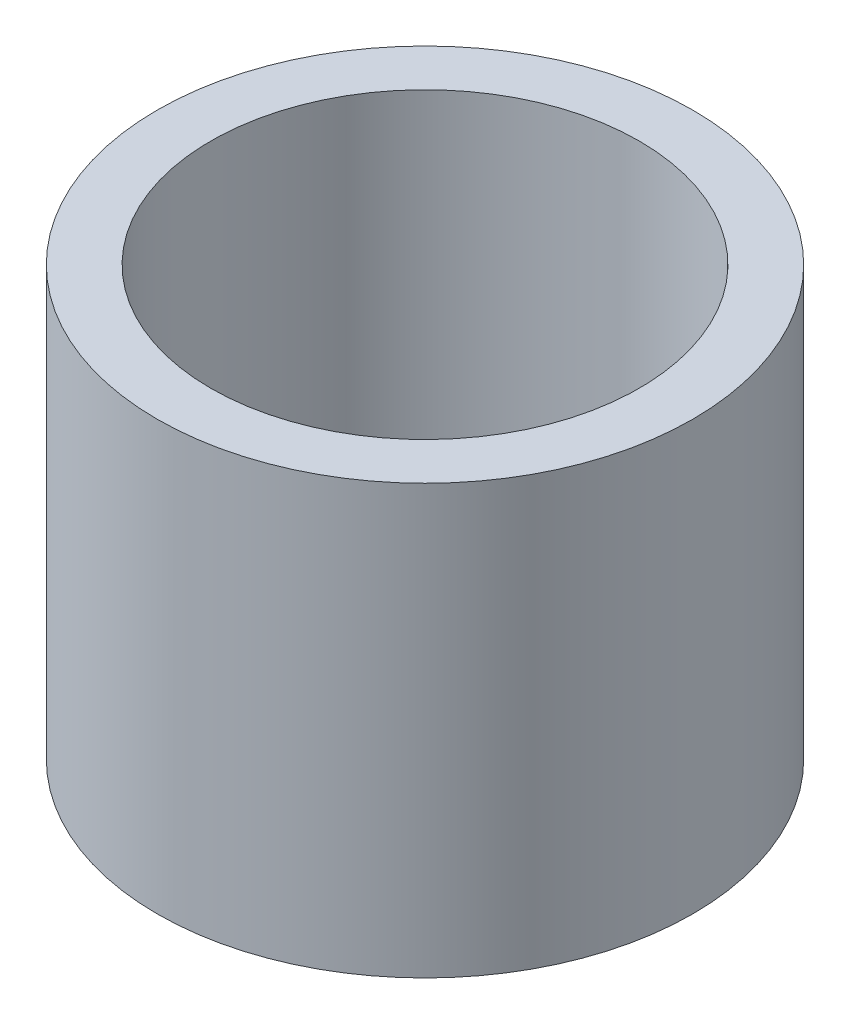
ISO-10303-21;
HEADER;
FILE_DESCRIPTION(('STEP AP214'),'2;1');
FILE_NAME('part.step','',(''),(''),'','','');
FILE_SCHEMA(('AUTOMOTIVE_DESIGN { 1 0 10303 214 1 1 1 1 }'));
ENDSEC;
DATA;
#1=APPLICATION_CONTEXT('core data for automotive mechanical design processes');
#2=APPLICATION_PROTOCOL_DEFINITION('international standard','automotive_design',2000,#1);
#3=PRODUCT_CONTEXT('',#1,'mechanical');
#4=PRODUCT('Part','Part','',(#3));
#5=PRODUCT_RELATED_PRODUCT_CATEGORY('part','',(#4));
#6=PRODUCT_DEFINITION_FORMATION('','',#4);
#7=PRODUCT_DEFINITION_CONTEXT('part definition',#1,'design');
#8=PRODUCT_DEFINITION('design','',#6,#7);
#9=PRODUCT_DEFINITION_SHAPE('','',#8);
#10=(LENGTH_UNIT() NAMED_UNIT(*) SI_UNIT(.MILLI.,.METRE.));
#11=(NAMED_UNIT(*) PLANE_ANGLE_UNIT() SI_UNIT($,.RADIAN.));
#12=(NAMED_UNIT(*) SI_UNIT($,.STERADIAN.) SOLID_ANGLE_UNIT());
#13=UNCERTAINTY_MEASURE_WITH_UNIT(LENGTH_MEASURE(1.E-05),#10,'distance_accuracy_value','');
#14=(GEOMETRIC_REPRESENTATION_CONTEXT(3) GLOBAL_UNCERTAINTY_ASSIGNED_CONTEXT((#13)) GLOBAL_UNIT_ASSIGNED_CONTEXT((#10,
#11,#12)) REPRESENTATION_CONTEXT('',''));
#15=CARTESIAN_POINT('',(0.,0.,0.));
#16=DIRECTION('',(0.,0.,1.));
#17=DIRECTION('',(1.,0.,0.));
#18=AXIS2_PLACEMENT_3D('',#15,#16,#17);
#19=CARTESIAN_POINT('',(0.,50.8,0.));
#20=DIRECTION('',(0.,1.,0.));
#21=DIRECTION('',(0.,0.,1.));
#22=AXIS2_PLACEMENT_3D('',#19,#20,#21);
#23=PLANE('',#22);
#24=CARTESIAN_POINT('',(0.,50.8,0.));
#25=DIRECTION('',(0.,1.,0.));
#26=DIRECTION('',(0.,0.,1.));
#27=AXIS2_PLACEMENT_3D('',#24,#25,#26);
#28=CIRCLE('',#27,31.75);
#29=CARTESIAN_POINT('',(0.,50.8,31.75));
#30=VERTEX_POINT('',#29);
#31=EDGE_CURVE('E10',#30,#30,#28,.T.);
#32=ORIENTED_EDGE('',*,*,#31,.T.);
#33=EDGE_LOOP('',(#32));
#34=FACE_BOUND('',#33,.T.);
#35=CARTESIAN_POINT('',(0.,50.8,0.));
#36=DIRECTION('',(0.,1.,0.));
#37=DIRECTION('',(0.,0.,1.));
#38=AXIS2_PLACEMENT_3D('',#35,#36,#37);
#39=CIRCLE('',#38,25.4);
#40=CARTESIAN_POINT('',(0.,50.8,25.4));
#41=VERTEX_POINT('',#40);
#42=EDGE_CURVE('E42',#41,#41,#39,.T.);
#43=ORIENTED_EDGE('',*,*,#42,.F.);
#44=EDGE_LOOP('',(#43));
#45=FACE_BOUND('',#44,.T.);
#46=ADVANCED_FACE('F31',(#34,#45),#23,.T.);
#47=CARTESIAN_POINT('',(0.,0.,0.));
#48=DIRECTION('',(0.,1.,0.));
#49=DIRECTION('',(0.,0.,1.));
#50=AXIS2_PLACEMENT_3D('',#47,#48,#49);
#51=PLANE('',#50);
#52=CARTESIAN_POINT('',(0.,0.,0.));
#53=DIRECTION('',(0.,1.,0.));
#54=DIRECTION('',(0.,0.,1.));
#55=AXIS2_PLACEMENT_3D('',#52,#53,#54);
#56=CIRCLE('',#55,31.75);
#57=CARTESIAN_POINT('',(0.,0.,31.75));
#58=VERTEX_POINT('',#57);
#59=EDGE_CURVE('E35',#58,#58,#56,.T.);
#60=ORIENTED_EDGE('',*,*,#59,.F.);
#61=EDGE_LOOP('',(#60));
#62=FACE_BOUND('',#61,.T.);
#63=CARTESIAN_POINT('',(0.,0.,0.));
#64=DIRECTION('',(0.,1.,0.));
#65=DIRECTION('',(0.,0.,1.));
#66=AXIS2_PLACEMENT_3D('',#63,#64,#65);
#67=CIRCLE('',#66,25.4);
#68=CARTESIAN_POINT('',(0.,0.,25.4));
#69=VERTEX_POINT('',#68);
#70=EDGE_CURVE('E44',#69,#69,#67,.T.);
#71=ORIENTED_EDGE('',*,*,#70,.T.);
#72=EDGE_LOOP('',(#71));
#73=FACE_BOUND('',#72,.T.);
#74=ADVANCED_FACE('F54',(#62,#73),#51,.F.);
#75=CARTESIAN_POINT('',(0.,50.8,0.));
#76=DIRECTION('',(0.,-1.,0.));
#77=DIRECTION('',(0.,0.,-1.));
#78=AXIS2_PLACEMENT_3D('',#75,#76,#77);
#79=CYLINDRICAL_SURFACE('',#78,31.75);
#80=ORIENTED_EDGE('',*,*,#31,.F.);
#81=EDGE_LOOP('',(#80));
#82=FACE_BOUND('',#81,.T.);
#83=ORIENTED_EDGE('',*,*,#59,.T.);
#84=EDGE_LOOP('',(#83));
#85=FACE_BOUND('',#84,.T.);
#86=ADVANCED_FACE('F33',(#82,#85),#79,.T.);
#87=CARTESIAN_POINT('',(0.,50.8,0.));
#88=DIRECTION('',(0.,-1.,0.));
#89=DIRECTION('',(0.,0.,-1.));
#90=AXIS2_PLACEMENT_3D('',#87,#88,#89);
#91=CYLINDRICAL_SURFACE('',#90,25.4);
#92=ORIENTED_EDGE('',*,*,#42,.T.);
#93=EDGE_LOOP('',(#92));
#94=FACE_BOUND('',#93,.T.);
#95=ORIENTED_EDGE('',*,*,#70,.F.);
#96=EDGE_LOOP('',(#95));
#97=FACE_BOUND('',#96,.T.);
#98=ADVANCED_FACE('F50',(#94,#97),#91,.F.);
#99=CLOSED_SHELL('',(#46,#74,#86,#98));
#100=MANIFOLD_SOLID_BREP('B2',#99);
#101=ADVANCED_BREP_SHAPE_REPRESENTATION('',(#18,#100),#14);
#102=SHAPE_DEFINITION_REPRESENTATION(#9,#101);
ENDSEC;
END-ISO-10303-21;
